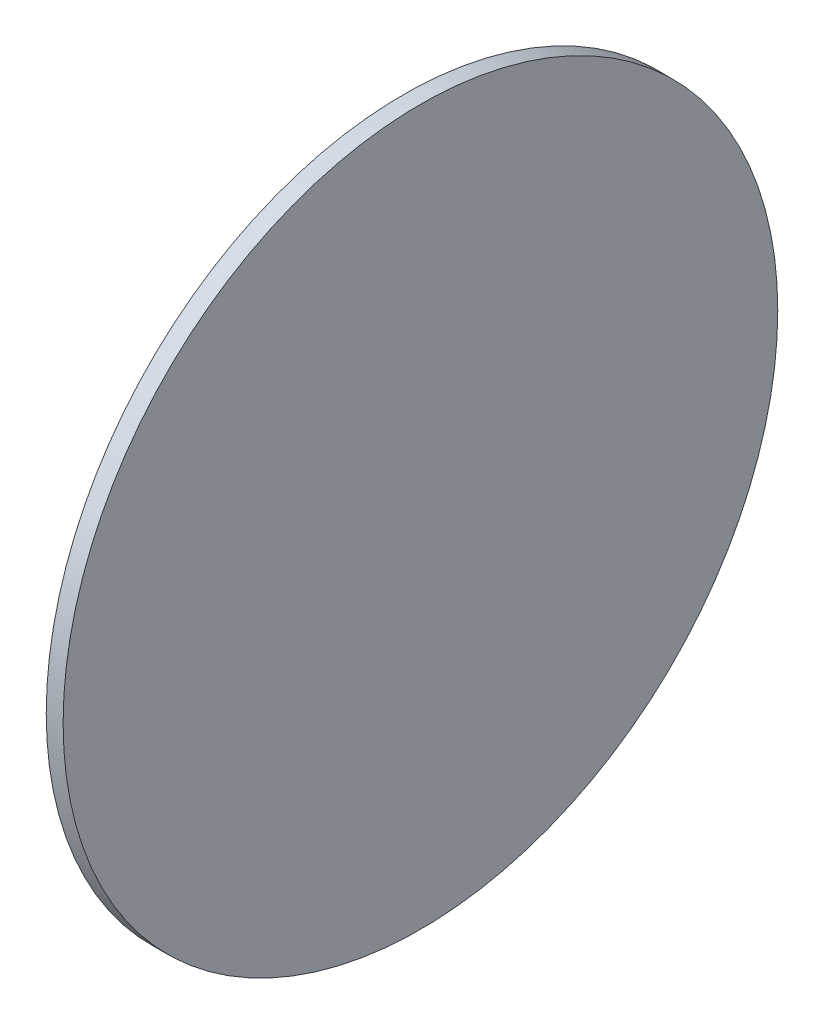
ISO-10303-21;
HEADER;
FILE_DESCRIPTION(('STEP AP214'),'2;1');
FILE_NAME('part.step','',(''),(''),'','','');
FILE_SCHEMA(('AUTOMOTIVE_DESIGN { 1 0 10303 214 1 1 1 1 }'));
ENDSEC;
DATA;
#1=APPLICATION_CONTEXT('core data for automotive mechanical design processes');
#2=APPLICATION_PROTOCOL_DEFINITION('international standard','automotive_design',2000,#1);
#3=PRODUCT_CONTEXT('',#1,'mechanical');
#4=PRODUCT('Part','Part','',(#3));
#5=PRODUCT_RELATED_PRODUCT_CATEGORY('part','',(#4));
#6=PRODUCT_DEFINITION_FORMATION('','',#4);
#7=PRODUCT_DEFINITION_CONTEXT('part definition',#1,'design');
#8=PRODUCT_DEFINITION('design','',#6,#7);
#9=PRODUCT_DEFINITION_SHAPE('','',#8);
#10=(LENGTH_UNIT() NAMED_UNIT(*) SI_UNIT(.MILLI.,.METRE.));
#11=(NAMED_UNIT(*) PLANE_ANGLE_UNIT() SI_UNIT($,.RADIAN.));
#12=(NAMED_UNIT(*) SI_UNIT($,.STERADIAN.) SOLID_ANGLE_UNIT());
#13=UNCERTAINTY_MEASURE_WITH_UNIT(LENGTH_MEASURE(1.E-05),#10,'distance_accuracy_value','');
#14=(GEOMETRIC_REPRESENTATION_CONTEXT(3) GLOBAL_UNCERTAINTY_ASSIGNED_CONTEXT((#13)) GLOBAL_UNIT_ASSIGNED_CONTEXT((#10,
#11,#12)) REPRESENTATION_CONTEXT('',''));
#15=CARTESIAN_POINT('',(0.,0.,0.));
#16=DIRECTION('',(0.,0.,1.));
#17=DIRECTION('',(1.,0.,0.));
#18=AXIS2_PLACEMENT_3D('',#15,#16,#17);
#19=CARTESIAN_POINT('',(15.,0.,0.));
#20=DIRECTION('',(-1.,0.,0.));
#21=DIRECTION('',(0.,0.,1.));
#22=AXIS2_PLACEMENT_3D('',#19,#20,#21);
#23=CYLINDRICAL_SURFACE('',#22,317.5);
#24=CARTESIAN_POINT('',(15.,0.,0.));
#25=DIRECTION('',(1.,0.,0.));
#26=DIRECTION('',(0.,0.,-1.));
#27=AXIS2_PLACEMENT_3D('',#24,#25,#26);
#28=CIRCLE('',#27,317.5);
#29=CARTESIAN_POINT('',(15.,0.,-317.5));
#30=VERTEX_POINT('',#29);
#31=EDGE_CURVE('E10',#30,#30,#28,.T.);
#32=ORIENTED_EDGE('',*,*,#31,.F.);
#33=EDGE_LOOP('',(#32));
#34=FACE_BOUND('',#33,.T.);
#35=CARTESIAN_POINT('',(0.,0.,0.));
#36=DIRECTION('',(1.,0.,0.));
#37=DIRECTION('',(0.,0.,-1.));
#38=AXIS2_PLACEMENT_3D('',#35,#36,#37);
#39=CIRCLE('',#38,317.5);
#40=CARTESIAN_POINT('',(0.,0.,-317.5));
#41=VERTEX_POINT('',#40);
#42=EDGE_CURVE('E34',#41,#41,#39,.T.);
#43=ORIENTED_EDGE('',*,*,#42,.T.);
#44=EDGE_LOOP('',(#43));
#45=FACE_BOUND('',#44,.T.);
#46=ADVANCED_FACE('F31',(#34,#45),#23,.T.);
#47=CARTESIAN_POINT('',(15.,0.,0.));
#48=DIRECTION('',(1.,0.,0.));
#49=DIRECTION('',(0.,0.,-1.));
#50=AXIS2_PLACEMENT_3D('',#47,#48,#49);
#51=PLANE('',#50);
#52=ORIENTED_EDGE('',*,*,#31,.T.);
#53=EDGE_LOOP('',(#52));
#54=FACE_BOUND('',#53,.T.);
#55=ADVANCED_FACE('F46',(#54),#51,.T.);
#56=CARTESIAN_POINT('',(0.,0.,0.));
#57=DIRECTION('',(1.,0.,0.));
#58=DIRECTION('',(0.,0.,-1.));
#59=AXIS2_PLACEMENT_3D('',#56,#57,#58);
#60=PLANE('',#59);
#61=ORIENTED_EDGE('',*,*,#42,.F.);
#62=EDGE_LOOP('',(#61));
#63=FACE_BOUND('',#62,.T.);
#64=ADVANCED_FACE('F44',(#63),#60,.F.);
#65=CLOSED_SHELL('',(#46,#55,#64));
#66=MANIFOLD_SOLID_BREP('B2',#65);
#67=ADVANCED_BREP_SHAPE_REPRESENTATION('',(#18,#66),#14);
#68=SHAPE_DEFINITION_REPRESENTATION(#9,#67);
ENDSEC;
END-ISO-10303-21;
